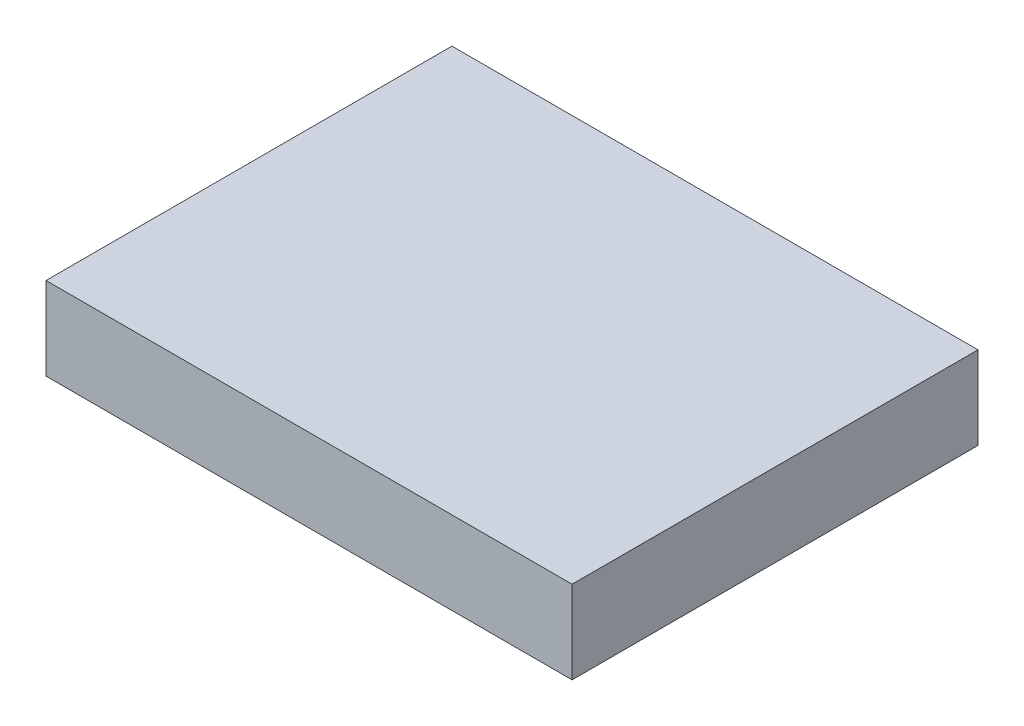
ISO-10303-21;
HEADER;
FILE_DESCRIPTION(('STEP AP214'),'2;1');
FILE_NAME('part.step','',(''),(''),'','','');
FILE_SCHEMA(('AUTOMOTIVE_DESIGN { 1 0 10303 214 1 1 1 1 }'));
ENDSEC;
DATA;
#1=APPLICATION_CONTEXT('core data for automotive mechanical design processes');
#2=APPLICATION_PROTOCOL_DEFINITION('international standard','automotive_design',2000,#1);
#3=PRODUCT_CONTEXT('',#1,'mechanical');
#4=PRODUCT('Part','Part','',(#3));
#5=PRODUCT_RELATED_PRODUCT_CATEGORY('part','',(#4));
#6=PRODUCT_DEFINITION_FORMATION('','',#4);
#7=PRODUCT_DEFINITION_CONTEXT('part definition',#1,'design');
#8=PRODUCT_DEFINITION('design','',#6,#7);
#9=PRODUCT_DEFINITION_SHAPE('','',#8);
#10=(LENGTH_UNIT() NAMED_UNIT(*) SI_UNIT(.MILLI.,.METRE.));
#11=(NAMED_UNIT(*) PLANE_ANGLE_UNIT() SI_UNIT($,.RADIAN.));
#12=(NAMED_UNIT(*) SI_UNIT($,.STERADIAN.) SOLID_ANGLE_UNIT());
#13=UNCERTAINTY_MEASURE_WITH_UNIT(LENGTH_MEASURE(1.E-05),#10,'distance_accuracy_value','');
#14=(GEOMETRIC_REPRESENTATION_CONTEXT(3) GLOBAL_UNCERTAINTY_ASSIGNED_CONTEXT((#13)) GLOBAL_UNIT_ASSIGNED_CONTEXT((#10,
#11,#12)) REPRESENTATION_CONTEXT('',''));
#15=CARTESIAN_POINT('',(0.,0.,0.));
#16=DIRECTION('',(0.,0.,1.));
#17=DIRECTION('',(1.,0.,0.));
#18=AXIS2_PLACEMENT_3D('',#15,#16,#17);
#19=CARTESIAN_POINT('',(-63.5,20.,-49.));
#20=DIRECTION('',(1.,0.,0.));
#21=DIRECTION('',(0.,0.,-1.));
#22=AXIS2_PLACEMENT_3D('',#19,#20,#21);
#23=PLANE('',#22);
#24=DIRECTION('',(0.,0.,1.));
#25=VECTOR('',#24,1.);
#26=CARTESIAN_POINT('',(-63.5,0.,-49.));
#27=LINE('',#26,#25);
#28=CARTESIAN_POINT('',(-63.5,0.,-49.));
#29=VERTEX_POINT('',#28);
#30=CARTESIAN_POINT('',(-63.5,0.,49.));
#31=VERTEX_POINT('',#30);
#32=EDGE_CURVE('E76',#29,#31,#27,.T.);
#33=ORIENTED_EDGE('',*,*,#32,.T.);
#34=DIRECTION('',(0.,-1.,0.));
#35=VECTOR('',#34,1.);
#36=CARTESIAN_POINT('',(-63.5,20.,49.));
#37=LINE('',#36,#35);
#38=CARTESIAN_POINT('',(-63.5,20.,49.));
#39=VERTEX_POINT('',#38);
#40=EDGE_CURVE('E11',#39,#31,#37,.T.);
#41=ORIENTED_EDGE('',*,*,#40,.F.);
#42=DIRECTION('',(0.,0.,1.));
#43=VECTOR('',#42,1.);
#44=CARTESIAN_POINT('',(-63.5,20.,-49.));
#45=LINE('',#44,#43);
#46=CARTESIAN_POINT('',(-63.5,20.,-49.));
#47=VERTEX_POINT('',#46);
#48=EDGE_CURVE('E94',#47,#39,#45,.T.);
#49=ORIENTED_EDGE('',*,*,#48,.F.);
#50=DIRECTION('',(0.,-1.,0.));
#51=VECTOR('',#50,1.);
#52=CARTESIAN_POINT('',(-63.5,20.,-49.));
#53=LINE('',#52,#51);
#54=EDGE_CURVE('E88',#47,#29,#53,.T.);
#55=ORIENTED_EDGE('',*,*,#54,.T.);
#56=EDGE_LOOP('',(#33,#41,#49,#55));
#57=FACE_BOUND('',#56,.T.);
#58=ADVANCED_FACE('F32',(#57),#23,.F.);
#59=CARTESIAN_POINT('',(-63.5,20.,49.));
#60=DIRECTION('',(0.,0.,-1.));
#61=DIRECTION('',(-1.,0.,0.));
#62=AXIS2_PLACEMENT_3D('',#59,#60,#61);
#63=PLANE('',#62);
#64=DIRECTION('',(1.,0.,0.));
#65=VECTOR('',#64,1.);
#66=CARTESIAN_POINT('',(-63.5,0.,49.));
#67=LINE('',#66,#65);
#68=CARTESIAN_POINT('',(63.5,0.,49.));
#69=VERTEX_POINT('',#68);
#70=EDGE_CURVE('E72',#31,#69,#67,.T.);
#71=ORIENTED_EDGE('',*,*,#70,.T.);
#72=DIRECTION('',(0.,-1.,0.));
#73=VECTOR('',#72,1.);
#74=CARTESIAN_POINT('',(63.5,20.,49.));
#75=LINE('',#74,#73);
#76=CARTESIAN_POINT('',(63.5,20.,49.));
#77=VERTEX_POINT('',#76);
#78=EDGE_CURVE('E39',#77,#69,#75,.T.);
#79=ORIENTED_EDGE('',*,*,#78,.F.);
#80=DIRECTION('',(1.,0.,0.));
#81=VECTOR('',#80,1.);
#82=CARTESIAN_POINT('',(-63.5,20.,49.));
#83=LINE('',#82,#81);
#84=EDGE_CURVE('E84',#39,#77,#83,.T.);
#85=ORIENTED_EDGE('',*,*,#84,.F.);
#86=ORIENTED_EDGE('',*,*,#40,.T.);
#87=EDGE_LOOP('',(#71,#79,#85,#86));
#88=FACE_BOUND('',#87,.T.);
#89=ADVANCED_FACE('F83',(#88),#63,.F.);
#90=CARTESIAN_POINT('',(63.5,20.,-49.));
#91=DIRECTION('',(-1.,0.,0.));
#92=DIRECTION('',(0.,0.,1.));
#93=AXIS2_PLACEMENT_3D('',#90,#91,#92);
#94=PLANE('',#93);
#95=DIRECTION('',(0.,0.,-1.));
#96=VECTOR('',#95,1.);
#97=CARTESIAN_POINT('',(63.5,0.,-49.));
#98=LINE('',#97,#96);
#99=CARTESIAN_POINT('',(63.5,0.,-49.));
#100=VERTEX_POINT('',#99);
#101=EDGE_CURVE('E77',#69,#100,#98,.T.);
#102=ORIENTED_EDGE('',*,*,#101,.T.);
#103=DIRECTION('',(0.,-1.,0.));
#104=VECTOR('',#103,1.);
#105=CARTESIAN_POINT('',(63.5,20.,-49.));
#106=LINE('',#105,#104);
#107=CARTESIAN_POINT('',(63.5,20.,-49.));
#108=VERTEX_POINT('',#107);
#109=EDGE_CURVE('E100',#108,#100,#106,.T.);
#110=ORIENTED_EDGE('',*,*,#109,.F.);
#111=DIRECTION('',(0.,0.,-1.));
#112=VECTOR('',#111,1.);
#113=CARTESIAN_POINT('',(63.5,20.,-49.));
#114=LINE('',#113,#112);
#115=EDGE_CURVE('E51',#77,#108,#114,.T.);
#116=ORIENTED_EDGE('',*,*,#115,.F.);
#117=ORIENTED_EDGE('',*,*,#78,.T.);
#118=EDGE_LOOP('',(#102,#110,#116,#117));
#119=FACE_BOUND('',#118,.T.);
#120=ADVANCED_FACE('F103',(#119),#94,.F.);
#121=CARTESIAN_POINT('',(-63.5,20.,-49.));
#122=DIRECTION('',(0.,0.,1.));
#123=DIRECTION('',(1.,0.,0.));
#124=AXIS2_PLACEMENT_3D('',#121,#122,#123);
#125=PLANE('',#124);
#126=DIRECTION('',(-1.,0.,0.));
#127=VECTOR('',#126,1.);
#128=CARTESIAN_POINT('',(-63.5,0.,-49.));
#129=LINE('',#128,#127);
#130=EDGE_CURVE('E92',#100,#29,#129,.T.);
#131=ORIENTED_EDGE('',*,*,#130,.T.);
#132=ORIENTED_EDGE('',*,*,#54,.F.);
#133=DIRECTION('',(-1.,0.,0.));
#134=VECTOR('',#133,1.);
#135=CARTESIAN_POINT('',(-63.5,20.,-49.));
#136=LINE('',#135,#134);
#137=EDGE_CURVE('E46',#108,#47,#136,.T.);
#138=ORIENTED_EDGE('',*,*,#137,.F.);
#139=ORIENTED_EDGE('',*,*,#109,.T.);
#140=EDGE_LOOP('',(#131,#132,#138,#139));
#141=FACE_BOUND('',#140,.T.);
#142=ADVANCED_FACE('F105',(#141),#125,.F.);
#143=CARTESIAN_POINT('',(-63.5,20.,49.));
#144=DIRECTION('',(0.,1.,0.));
#145=DIRECTION('',(0.,0.,1.));
#146=AXIS2_PLACEMENT_3D('',#143,#144,#145);
#147=PLANE('',#146);
#148=ORIENTED_EDGE('',*,*,#48,.T.);
#149=ORIENTED_EDGE('',*,*,#84,.T.);
#150=ORIENTED_EDGE('',*,*,#115,.T.);
#151=ORIENTED_EDGE('',*,*,#137,.T.);
#152=EDGE_LOOP('',(#148,#149,#150,#151));
#153=FACE_BOUND('',#152,.T.);
#154=ADVANCED_FACE('F106',(#153),#147,.T.);
#155=CARTESIAN_POINT('',(-63.5,0.,49.));
#156=DIRECTION('',(0.,1.,0.));
#157=DIRECTION('',(0.,0.,1.));
#158=AXIS2_PLACEMENT_3D('',#155,#156,#157);
#159=PLANE('',#158);
#160=ORIENTED_EDGE('',*,*,#32,.F.);
#161=ORIENTED_EDGE('',*,*,#130,.F.);
#162=ORIENTED_EDGE('',*,*,#101,.F.);
#163=ORIENTED_EDGE('',*,*,#70,.F.);
#164=EDGE_LOOP('',(#160,#161,#162,#163));
#165=FACE_BOUND('',#164,.T.);
#166=ADVANCED_FACE('F73',(#165),#159,.F.);
#167=CLOSED_SHELL('',(#58,#89,#120,#142,#154,#166));
#168=MANIFOLD_SOLID_BREP('B2',#167);
#169=ADVANCED_BREP_SHAPE_REPRESENTATION('',(#18,#168),#14);
#170=SHAPE_DEFINITION_REPRESENTATION(#9,#169);
ENDSEC;
END-ISO-10303-21;
